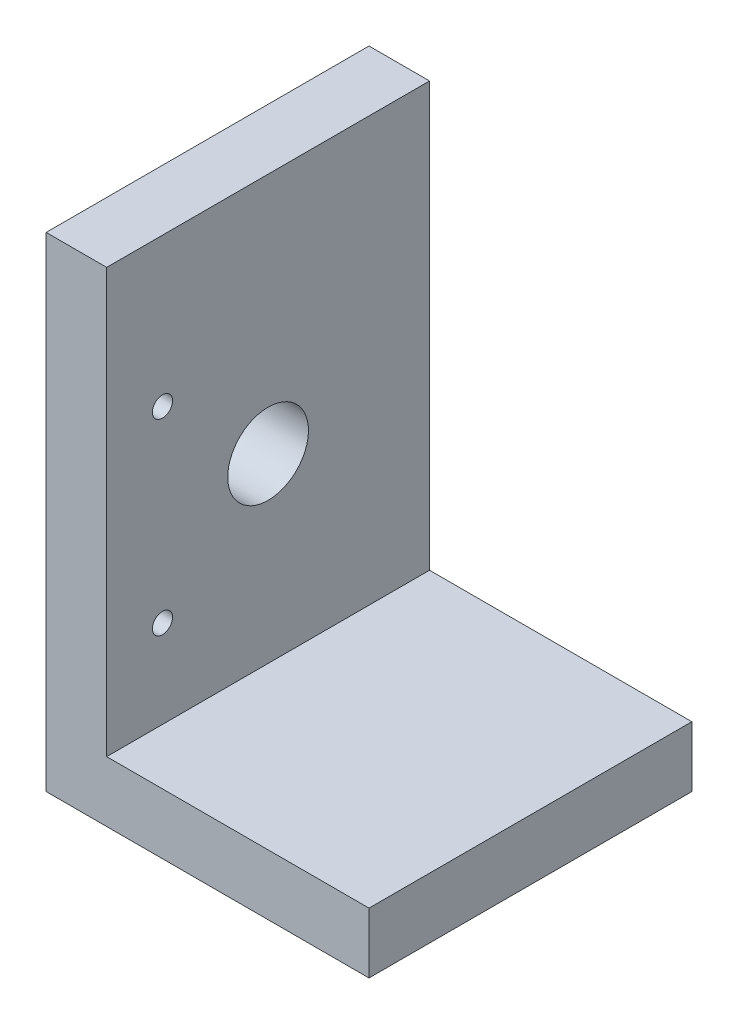
ISO-10303-21;
HEADER;
FILE_DESCRIPTION(('STEP AP214'),'2;1');
FILE_NAME('part.step','',(''),(''),'','','');
FILE_SCHEMA(('AUTOMOTIVE_DESIGN { 1 0 10303 214 1 1 1 1 }'));
ENDSEC;
DATA;
#1=APPLICATION_CONTEXT('core data for automotive mechanical design processes');
#2=APPLICATION_PROTOCOL_DEFINITION('international standard','automotive_design',2000,#1);
#3=PRODUCT_CONTEXT('',#1,'mechanical');
#4=PRODUCT('Part','Part','',(#3));
#5=PRODUCT_RELATED_PRODUCT_CATEGORY('part','',(#4));
#6=PRODUCT_DEFINITION_FORMATION('','',#4);
#7=PRODUCT_DEFINITION_CONTEXT('part definition',#1,'design');
#8=PRODUCT_DEFINITION('design','',#6,#7);
#9=PRODUCT_DEFINITION_SHAPE('','',#8);
#10=(LENGTH_UNIT() NAMED_UNIT(*) SI_UNIT(.MILLI.,.METRE.));
#11=(NAMED_UNIT(*) PLANE_ANGLE_UNIT() SI_UNIT($,.RADIAN.));
#12=(NAMED_UNIT(*) SI_UNIT($,.STERADIAN.) SOLID_ANGLE_UNIT());
#13=UNCERTAINTY_MEASURE_WITH_UNIT(LENGTH_MEASURE(1.E-05),#10,'distance_accuracy_value','');
#14=(GEOMETRIC_REPRESENTATION_CONTEXT(3) GLOBAL_UNCERTAINTY_ASSIGNED_CONTEXT((#13)) GLOBAL_UNIT_ASSIGNED_CONTEXT((#10,
#11,#12)) REPRESENTATION_CONTEXT('',''));
#15=CARTESIAN_POINT('',(0.,0.,0.));
#16=DIRECTION('',(0.,0.,1.));
#17=DIRECTION('',(1.,0.,0.));
#18=AXIS2_PLACEMENT_3D('',#15,#16,#17);
#19=CARTESIAN_POINT('',(50.8,0.,25.4));
#20=DIRECTION('',(0.,1.,0.));
#21=DIRECTION('',(-1.,0.,0.));
#22=AXIS2_PLACEMENT_3D('',#19,#20,#21);
#23=PLANE('',#22);
#24=DIRECTION('',(1.,0.,0.));
#25=VECTOR('',#24,1.);
#26=CARTESIAN_POINT('',(50.8,0.,-25.4));
#27=LINE('',#26,#25);
#28=CARTESIAN_POINT('',(0.,0.,-25.4));
#29=VERTEX_POINT('',#28);
#30=CARTESIAN_POINT('',(50.8,0.,-25.4));
#31=VERTEX_POINT('',#30);
#32=EDGE_CURVE('E119',#29,#31,#27,.T.);
#33=ORIENTED_EDGE('',*,*,#32,.T.);
#34=DIRECTION('',(0.,0.,-1.));
#35=VECTOR('',#34,1.);
#36=CARTESIAN_POINT('',(50.8,0.,25.4));
#37=LINE('',#36,#35);
#38=CARTESIAN_POINT('',(50.8,0.,25.4));
#39=VERTEX_POINT('',#38);
#40=EDGE_CURVE('E11',#39,#31,#37,.T.);
#41=ORIENTED_EDGE('',*,*,#40,.F.);
#42=DIRECTION('',(1.,0.,0.));
#43=VECTOR('',#42,1.);
#44=CARTESIAN_POINT('',(50.8,0.,25.4));
#45=LINE('',#44,#43);
#46=CARTESIAN_POINT('',(0.,0.,25.4));
#47=VERTEX_POINT('',#46);
#48=EDGE_CURVE('E130',#47,#39,#45,.T.);
#49=ORIENTED_EDGE('',*,*,#48,.F.);
#50=DIRECTION('',(0.,0.,-1.));
#51=VECTOR('',#50,1.);
#52=CARTESIAN_POINT('',(0.,0.,25.4));
#53=LINE('',#52,#51);
#54=EDGE_CURVE('E115',#47,#29,#53,.T.);
#55=ORIENTED_EDGE('',*,*,#54,.T.);
#56=EDGE_LOOP('',(#33,#41,#49,#55));
#57=FACE_BOUND('',#56,.T.);
#58=ADVANCED_FACE('F35',(#57),#23,.F.);
#59=CARTESIAN_POINT('',(50.8,9.525,25.4));
#60=DIRECTION('',(-1.,0.,0.));
#61=DIRECTION('',(0.,0.,1.));
#62=AXIS2_PLACEMENT_3D('',#59,#60,#61);
#63=PLANE('',#62);
#64=DIRECTION('',(0.,1.,0.));
#65=VECTOR('',#64,1.);
#66=CARTESIAN_POINT('',(50.8,9.525,-25.4));
#67=LINE('',#66,#65);
#68=CARTESIAN_POINT('',(50.8,9.525,-25.4));
#69=VERTEX_POINT('',#68);
#70=EDGE_CURVE('E122',#31,#69,#67,.T.);
#71=ORIENTED_EDGE('',*,*,#70,.T.);
#72=DIRECTION('',(0.,0.,-1.));
#73=VECTOR('',#72,1.);
#74=CARTESIAN_POINT('',(50.8,9.525,25.4));
#75=LINE('',#74,#73);
#76=CARTESIAN_POINT('',(50.8,9.525,25.4));
#77=VERTEX_POINT('',#76);
#78=EDGE_CURVE('E43',#77,#69,#75,.T.);
#79=ORIENTED_EDGE('',*,*,#78,.F.);
#80=DIRECTION('',(0.,1.,0.));
#81=VECTOR('',#80,1.);
#82=CARTESIAN_POINT('',(50.8,9.525,25.4));
#83=LINE('',#82,#81);
#84=EDGE_CURVE('E88',#39,#77,#83,.T.);
#85=ORIENTED_EDGE('',*,*,#84,.F.);
#86=ORIENTED_EDGE('',*,*,#40,.T.);
#87=EDGE_LOOP('',(#71,#79,#85,#86));
#88=FACE_BOUND('',#87,.T.);
#89=ADVANCED_FACE('F157',(#88),#63,.F.);
#90=CARTESIAN_POINT('',(9.52500000000001,9.525,25.4));
#91=DIRECTION('',(0.,-1.,0.));
#92=DIRECTION('',(0.,0.,-1.));
#93=AXIS2_PLACEMENT_3D('',#90,#91,#92);
#94=PLANE('',#93);
#95=DIRECTION('',(-1.,0.,0.));
#96=VECTOR('',#95,1.);
#97=CARTESIAN_POINT('',(9.52500000000001,9.525,-25.4));
#98=LINE('',#97,#96);
#99=CARTESIAN_POINT('',(9.52500000000001,9.525,-25.4));
#100=VERTEX_POINT('',#99);
#101=EDGE_CURVE('E125',#69,#100,#98,.T.);
#102=ORIENTED_EDGE('',*,*,#101,.T.);
#103=DIRECTION('',(0.,0.,-1.));
#104=VECTOR('',#103,1.);
#105=CARTESIAN_POINT('',(9.52500000000001,9.525,25.4));
#106=LINE('',#105,#104);
#107=CARTESIAN_POINT('',(9.52500000000001,9.525,25.4));
#108=VERTEX_POINT('',#107);
#109=EDGE_CURVE('E110',#108,#100,#106,.T.);
#110=ORIENTED_EDGE('',*,*,#109,.F.);
#111=DIRECTION('',(-1.,0.,0.));
#112=VECTOR('',#111,1.);
#113=CARTESIAN_POINT('',(9.52500000000001,9.525,25.4));
#114=LINE('',#113,#112);
#115=EDGE_CURVE('E101',#77,#108,#114,.T.);
#116=ORIENTED_EDGE('',*,*,#115,.F.);
#117=ORIENTED_EDGE('',*,*,#78,.T.);
#118=EDGE_LOOP('',(#102,#110,#116,#117));
#119=FACE_BOUND('',#118,.T.);
#120=ADVANCED_FACE('F136',(#119),#94,.F.);
#121=CARTESIAN_POINT('',(9.525,76.2,25.4));
#122=DIRECTION('',(-1.,0.,0.));
#123=DIRECTION('',(0.,-1.,0.));
#124=AXIS2_PLACEMENT_3D('',#121,#122,#123);
#125=PLANE('',#124);
#126=CARTESIAN_POINT('',(9.52500000000001,23.3461468873984,16.6215054472143));
#127=DIRECTION('',(1.,0.,0.));
#128=DIRECTION('',(0.,1.,0.));
#129=AXIS2_PLACEMENT_3D('',#126,#127,#128);
#130=CIRCLE('',#129,1.5875);
#131=CARTESIAN_POINT('',(9.52500000000001,24.9336468873984,16.6215054472143));
#132=VERTEX_POINT('',#131);
#133=EDGE_CURVE('E173',#132,#132,#130,.T.);
#134=ORIENTED_EDGE('',*,*,#133,.F.);
#135=EDGE_LOOP('',(#134));
#136=FACE_BOUND('',#135,.T.);
#137=CARTESIAN_POINT('',(9.525,52.8538531126016,16.6215054472143));
#138=DIRECTION('',(1.,0.,0.));
#139=DIRECTION('',(0.,1.,0.));
#140=AXIS2_PLACEMENT_3D('',#137,#138,#139);
#141=CIRCLE('',#140,1.5875);
#142=CARTESIAN_POINT('',(9.525,54.4413531126016,16.6215054472143));
#143=VERTEX_POINT('',#142);
#144=EDGE_CURVE('E177',#143,#143,#141,.T.);
#145=ORIENTED_EDGE('',*,*,#144,.F.);
#146=EDGE_LOOP('',(#145));
#147=FACE_BOUND('',#146,.T.);
#148=CARTESIAN_POINT('',(9.52500000000001,38.1,0.));
#149=DIRECTION('',(1.,0.,0.));
#150=DIRECTION('',(0.,1.,0.));
#151=AXIS2_PLACEMENT_3D('',#148,#149,#150);
#152=CIRCLE('',#151,6.35);
#153=CARTESIAN_POINT('',(9.52500000000001,44.45,0.));
#154=VERTEX_POINT('',#153);
#155=EDGE_CURVE('E180',#154,#154,#152,.T.);
#156=ORIENTED_EDGE('',*,*,#155,.F.);
#157=EDGE_LOOP('',(#156));
#158=FACE_BOUND('',#157,.T.);
#159=DIRECTION('',(0.,1.,0.));
#160=VECTOR('',#159,1.);
#161=CARTESIAN_POINT('',(9.525,76.2,-25.4));
#162=LINE('',#161,#160);
#163=CARTESIAN_POINT('',(9.525,76.2,-25.4));
#164=VERTEX_POINT('',#163);
#165=EDGE_CURVE('E109',#100,#164,#162,.T.);
#166=ORIENTED_EDGE('',*,*,#165,.T.);
#167=DIRECTION('',(0.,0.,-1.));
#168=VECTOR('',#167,1.);
#169=CARTESIAN_POINT('',(9.525,76.2,25.4));
#170=LINE('',#169,#168);
#171=CARTESIAN_POINT('',(9.525,76.2,25.4));
#172=VERTEX_POINT('',#171);
#173=EDGE_CURVE('E106',#172,#164,#170,.T.);
#174=ORIENTED_EDGE('',*,*,#173,.F.);
#175=DIRECTION('',(0.,1.,0.));
#176=VECTOR('',#175,1.);
#177=CARTESIAN_POINT('',(9.525,76.2,25.4));
#178=LINE('',#177,#176);
#179=EDGE_CURVE('E95',#108,#172,#178,.T.);
#180=ORIENTED_EDGE('',*,*,#179,.F.);
#181=ORIENTED_EDGE('',*,*,#109,.T.);
#182=EDGE_LOOP('',(#166,#174,#180,#181));
#183=FACE_BOUND('',#182,.T.);
#184=ADVANCED_FACE('F107',(#136,#147,#158,#183),#125,.F.);
#185=CARTESIAN_POINT('',(0.,76.2,25.4));
#186=DIRECTION('',(0.,-1.,0.));
#187=DIRECTION('',(0.,0.,-1.));
#188=AXIS2_PLACEMENT_3D('',#185,#186,#187);
#189=PLANE('',#188);
#190=DIRECTION('',(-1.,0.,0.));
#191=VECTOR('',#190,1.);
#192=CARTESIAN_POINT('',(0.,76.2,-25.4));
#193=LINE('',#192,#191);
#194=CARTESIAN_POINT('',(0.,76.2,-25.4));
#195=VERTEX_POINT('',#194);
#196=EDGE_CURVE('E74',#164,#195,#193,.T.);
#197=ORIENTED_EDGE('',*,*,#196,.T.);
#198=DIRECTION('',(0.,0.,-1.));
#199=VECTOR('',#198,1.);
#200=CARTESIAN_POINT('',(0.,76.2,25.4));
#201=LINE('',#200,#199);
#202=CARTESIAN_POINT('',(0.,76.2,25.4));
#203=VERTEX_POINT('',#202);
#204=EDGE_CURVE('E111',#203,#195,#201,.T.);
#205=ORIENTED_EDGE('',*,*,#204,.F.);
#206=DIRECTION('',(-1.,0.,0.));
#207=VECTOR('',#206,1.);
#208=CARTESIAN_POINT('',(0.,76.2,25.4));
#209=LINE('',#208,#207);
#210=EDGE_CURVE('E99',#172,#203,#209,.T.);
#211=ORIENTED_EDGE('',*,*,#210,.F.);
#212=ORIENTED_EDGE('',*,*,#173,.T.);
#213=EDGE_LOOP('',(#197,#205,#211,#212));
#214=FACE_BOUND('',#213,.T.);
#215=ADVANCED_FACE('F113',(#214),#189,.F.);
#216=CARTESIAN_POINT('',(0.,0.,25.4));
#217=DIRECTION('',(1.,0.,0.));
#218=DIRECTION('',(0.,0.,-1.));
#219=AXIS2_PLACEMENT_3D('',#216,#217,#218);
#220=PLANE('',#219);
#221=CARTESIAN_POINT('',(0.,23.3461468873984,16.6215054472143));
#222=DIRECTION('',(1.,0.,0.));
#223=DIRECTION('',(0.,1.,0.));
#224=AXIS2_PLACEMENT_3D('',#221,#222,#223);
#225=CIRCLE('',#224,1.5875);
#226=CARTESIAN_POINT('',(0.,24.9336468873984,16.6215054472143));
#227=VERTEX_POINT('',#226);
#228=EDGE_CURVE('E192',#227,#227,#225,.T.);
#229=ORIENTED_EDGE('',*,*,#228,.T.);
#230=EDGE_LOOP('',(#229));
#231=FACE_BOUND('',#230,.T.);
#232=CARTESIAN_POINT('',(0.,52.8538531126016,16.6215054472143));
#233=DIRECTION('',(1.,0.,0.));
#234=DIRECTION('',(0.,1.,0.));
#235=AXIS2_PLACEMENT_3D('',#232,#233,#234);
#236=CIRCLE('',#235,1.5875);
#237=CARTESIAN_POINT('',(0.,54.4413531126016,16.6215054472143));
#238=VERTEX_POINT('',#237);
#239=EDGE_CURVE('E182',#238,#238,#236,.T.);
#240=ORIENTED_EDGE('',*,*,#239,.T.);
#241=EDGE_LOOP('',(#240));
#242=FACE_BOUND('',#241,.T.);
#243=CARTESIAN_POINT('',(0.,38.1,0.));
#244=DIRECTION('',(1.,0.,0.));
#245=DIRECTION('',(0.,1.,0.));
#246=AXIS2_PLACEMENT_3D('',#243,#244,#245);
#247=CIRCLE('',#246,6.35);
#248=CARTESIAN_POINT('',(0.,44.45,0.));
#249=VERTEX_POINT('',#248);
#250=EDGE_CURVE('E123',#249,#249,#247,.T.);
#251=ORIENTED_EDGE('',*,*,#250,.T.);
#252=EDGE_LOOP('',(#251));
#253=FACE_BOUND('',#252,.T.);
#254=DIRECTION('',(0.,-1.,0.));
#255=VECTOR('',#254,1.);
#256=CARTESIAN_POINT('',(0.,0.,-25.4));
#257=LINE('',#256,#255);
#258=EDGE_CURVE('E80',#195,#29,#257,.T.);
#259=ORIENTED_EDGE('',*,*,#258,.T.);
#260=ORIENTED_EDGE('',*,*,#54,.F.);
#261=DIRECTION('',(0.,-1.,0.));
#262=VECTOR('',#261,1.);
#263=CARTESIAN_POINT('',(0.,0.,25.4));
#264=LINE('',#263,#262);
#265=EDGE_CURVE('E51',#203,#47,#264,.T.);
#266=ORIENTED_EDGE('',*,*,#265,.F.);
#267=ORIENTED_EDGE('',*,*,#204,.T.);
#268=EDGE_LOOP('',(#259,#260,#266,#267));
#269=FACE_BOUND('',#268,.T.);
#270=ADVANCED_FACE('F143',(#231,#242,#253,#269),#220,.F.);
#271=CARTESIAN_POINT('',(0.,0.,25.4));
#272=DIRECTION('',(0.,0.,-1.));
#273=DIRECTION('',(-1.,0.,0.));
#274=AXIS2_PLACEMENT_3D('',#271,#272,#273);
#275=PLANE('',#274);
#276=ORIENTED_EDGE('',*,*,#48,.T.);
#277=ORIENTED_EDGE('',*,*,#84,.T.);
#278=ORIENTED_EDGE('',*,*,#115,.T.);
#279=ORIENTED_EDGE('',*,*,#179,.T.);
#280=ORIENTED_EDGE('',*,*,#210,.T.);
#281=ORIENTED_EDGE('',*,*,#265,.T.);
#282=EDGE_LOOP('',(#276,#277,#278,#279,#280,#281));
#283=FACE_BOUND('',#282,.T.);
#284=ADVANCED_FACE('F97',(#283),#275,.F.);
#285=CARTESIAN_POINT('',(0.,0.,-25.4));
#286=DIRECTION('',(0.,0.,-1.));
#287=DIRECTION('',(-1.,0.,0.));
#288=AXIS2_PLACEMENT_3D('',#285,#286,#287);
#289=PLANE('',#288);
#290=ORIENTED_EDGE('',*,*,#32,.F.);
#291=ORIENTED_EDGE('',*,*,#258,.F.);
#292=ORIENTED_EDGE('',*,*,#196,.F.);
#293=ORIENTED_EDGE('',*,*,#165,.F.);
#294=ORIENTED_EDGE('',*,*,#101,.F.);
#295=ORIENTED_EDGE('',*,*,#70,.F.);
#296=EDGE_LOOP('',(#290,#291,#292,#293,#294,#295));
#297=FACE_BOUND('',#296,.T.);
#298=ADVANCED_FACE('F139',(#297),#289,.T.);
#299=CARTESIAN_POINT('',(0.,38.1,0.));
#300=DIRECTION('',(1.,0.,0.));
#301=DIRECTION('',(0.,1.,0.));
#302=AXIS2_PLACEMENT_3D('',#299,#300,#301);
#303=CYLINDRICAL_SURFACE('',#302,6.35);
#304=ORIENTED_EDGE('',*,*,#250,.F.);
#305=EDGE_LOOP('',(#304));
#306=FACE_BOUND('',#305,.T.);
#307=ORIENTED_EDGE('',*,*,#155,.T.);
#308=EDGE_LOOP('',(#307));
#309=FACE_BOUND('',#308,.T.);
#310=ADVANCED_FACE('F203',(#306,#309),#303,.F.);
#311=CARTESIAN_POINT('',(0.,52.8538531126016,16.6215054472143));
#312=DIRECTION('',(1.,0.,0.));
#313=DIRECTION('',(0.,1.,0.));
#314=AXIS2_PLACEMENT_3D('',#311,#312,#313);
#315=CYLINDRICAL_SURFACE('',#314,1.5875);
#316=ORIENTED_EDGE('',*,*,#239,.F.);
#317=EDGE_LOOP('',(#316));
#318=FACE_BOUND('',#317,.T.);
#319=ORIENTED_EDGE('',*,*,#144,.T.);
#320=EDGE_LOOP('',(#319));
#321=FACE_BOUND('',#320,.T.);
#322=ADVANCED_FACE('F197',(#318,#321),#315,.F.);
#323=CARTESIAN_POINT('',(0.,23.3461468873984,16.6215054472143));
#324=DIRECTION('',(1.,0.,0.));
#325=DIRECTION('',(0.,1.,0.));
#326=AXIS2_PLACEMENT_3D('',#323,#324,#325);
#327=CYLINDRICAL_SURFACE('',#326,1.5875);
#328=ORIENTED_EDGE('',*,*,#228,.F.);
#329=EDGE_LOOP('',(#328));
#330=FACE_BOUND('',#329,.T.);
#331=ORIENTED_EDGE('',*,*,#133,.T.);
#332=EDGE_LOOP('',(#331));
#333=FACE_BOUND('',#332,.T.);
#334=ADVANCED_FACE('F195',(#330,#333),#327,.F.);
#335=CLOSED_SHELL('',(#58,#89,#120,#184,#215,#270,#284,#298,#310,#322,#334));
#336=MANIFOLD_SOLID_BREP('B2',#335);
#337=ADVANCED_BREP_SHAPE_REPRESENTATION('',(#18,#336),#14);
#338=SHAPE_DEFINITION_REPRESENTATION(#9,#337);
ENDSEC;
END-ISO-10303-21;
